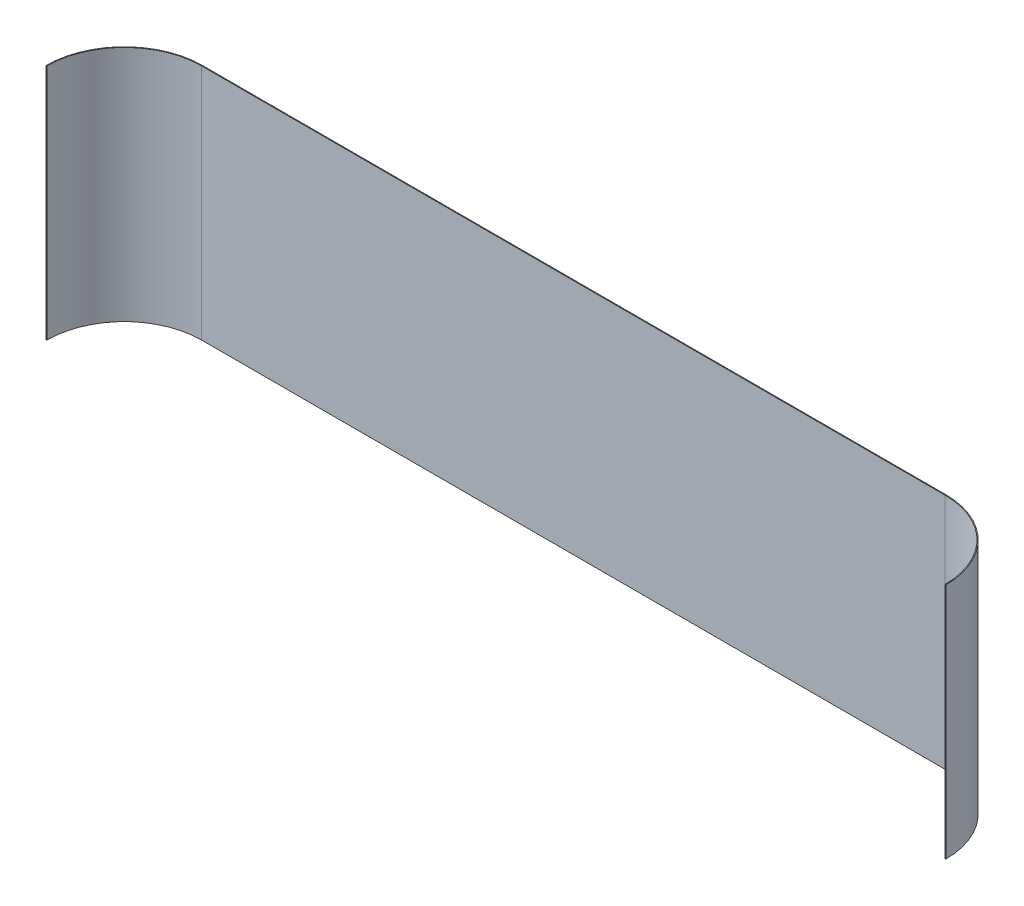
ISO-10303-21;
HEADER;
FILE_DESCRIPTION(('STEP AP214'),'2;1');
FILE_NAME('part.step','',(''),(''),'','','');
FILE_SCHEMA(('AUTOMOTIVE_DESIGN { 1 0 10303 214 1 1 1 1 }'));
ENDSEC;
DATA;
#1=APPLICATION_CONTEXT('core data for automotive mechanical design processes');
#2=APPLICATION_PROTOCOL_DEFINITION('international standard','automotive_design',2000,#1);
#3=PRODUCT_CONTEXT('',#1,'mechanical');
#4=PRODUCT('Part','Part','',(#3));
#5=PRODUCT_RELATED_PRODUCT_CATEGORY('part','',(#4));
#6=PRODUCT_DEFINITION_FORMATION('','',#4);
#7=PRODUCT_DEFINITION_CONTEXT('part definition',#1,'design');
#8=PRODUCT_DEFINITION('design','',#6,#7);
#9=PRODUCT_DEFINITION_SHAPE('','',#8);
#10=(LENGTH_UNIT() NAMED_UNIT(*) SI_UNIT(.MILLI.,.METRE.));
#11=(NAMED_UNIT(*) PLANE_ANGLE_UNIT() SI_UNIT($,.RADIAN.));
#12=(NAMED_UNIT(*) SI_UNIT($,.STERADIAN.) SOLID_ANGLE_UNIT());
#13=UNCERTAINTY_MEASURE_WITH_UNIT(LENGTH_MEASURE(1.E-05),#10,'distance_accuracy_value','');
#14=(GEOMETRIC_REPRESENTATION_CONTEXT(3) GLOBAL_UNCERTAINTY_ASSIGNED_CONTEXT((#13)) GLOBAL_UNIT_ASSIGNED_CONTEXT((#10,
#11,#12)) REPRESENTATION_CONTEXT('',''));
#15=CARTESIAN_POINT('',(0.,0.,0.));
#16=DIRECTION('',(0.,0.,1.));
#17=DIRECTION('',(1.,0.,0.));
#18=AXIS2_PLACEMENT_3D('',#15,#16,#17);
#19=CARTESIAN_POINT('',(-419.249999999999,230.,-39.8));
#20=DIRECTION('',(0.,1.,0.));
#21=DIRECTION('',(0.,0.,1.));
#22=AXIS2_PLACEMENT_3D('',#19,#20,#21);
#23=PLANE('',#22);
#24=DIRECTION('',(0.,0.,1.));
#25=VECTOR('',#24,1.);
#26=CARTESIAN_POINT('',(-419.249999999999,230.,-39.8));
#27=LINE('',#26,#25);
#28=CARTESIAN_POINT('',(-419.249999999999,230.,-39.8));
#29=VERTEX_POINT('',#28);
#30=CARTESIAN_POINT('',(-419.249999999999,230.,-39.));
#31=VERTEX_POINT('',#30);
#32=EDGE_CURVE('E11',#29,#31,#27,.T.);
#33=ORIENTED_EDGE('',*,*,#32,.F.);
#34=CARTESIAN_POINT('',(-419.25,230.,36.));
#35=DIRECTION('',(0.,1.,0.));
#36=DIRECTION('',(1.,0.,0.));
#37=AXIS2_PLACEMENT_3D('',#34,#35,#36);
#38=CIRCLE('',#37,75.8);
#39=CARTESIAN_POINT('',(-495.05,230.,36.0000000000005));
#40=VERTEX_POINT('',#39);
#41=EDGE_CURVE('E92',#29,#40,#38,.T.);
#42=ORIENTED_EDGE('',*,*,#41,.T.);
#43=DIRECTION('',(-1.,0.,0.));
#44=VECTOR('',#43,1.);
#45=CARTESIAN_POINT('',(-494.25,230.,36.0000000000005));
#46=LINE('',#45,#44);
#47=CARTESIAN_POINT('',(-494.25,230.,36.0000000000005));
#48=VERTEX_POINT('',#47);
#49=EDGE_CURVE('E341',#48,#40,#46,.T.);
#50=ORIENTED_EDGE('',*,*,#49,.F.);
#51=CARTESIAN_POINT('',(-419.25,230.,36.));
#52=DIRECTION('',(0.,1.,0.));
#53=DIRECTION('',(0.,0.,-1.));
#54=AXIS2_PLACEMENT_3D('',#51,#52,#53);
#55=CIRCLE('',#54,75.);
#56=EDGE_CURVE('E343',#31,#48,#55,.T.);
#57=ORIENTED_EDGE('',*,*,#56,.F.);
#58=EDGE_LOOP('',(#33,#42,#50,#57));
#59=FACE_BOUND('',#58,.T.);
#60=ADVANCED_FACE('F37',(#59),#23,.T.);
#61=CARTESIAN_POINT('',(-419.249999999999,0.,-39.));
#62=DIRECTION('',(0.,-1.,0.));
#63=DIRECTION('',(0.,0.,-1.));
#64=AXIS2_PLACEMENT_3D('',#61,#62,#63);
#65=PLANE('',#64);
#66=DIRECTION('',(0.,0.,-1.));
#67=VECTOR('',#66,1.);
#68=CARTESIAN_POINT('',(-419.249999999999,0.,-39.));
#69=LINE('',#68,#67);
#70=CARTESIAN_POINT('',(-419.249999999999,0.,-39.));
#71=VERTEX_POINT('',#70);
#72=CARTESIAN_POINT('',(-419.249999999999,0.,-39.8));
#73=VERTEX_POINT('',#72);
#74=EDGE_CURVE('E45',#71,#73,#69,.T.);
#75=ORIENTED_EDGE('',*,*,#74,.F.);
#76=CARTESIAN_POINT('',(-419.25,0.,36.));
#77=DIRECTION('',(0.,1.,0.));
#78=DIRECTION('',(0.,0.,-1.));
#79=AXIS2_PLACEMENT_3D('',#76,#77,#78);
#80=CIRCLE('',#79,75.);
#81=CARTESIAN_POINT('',(-494.25,0.,36.0000000000005));
#82=VERTEX_POINT('',#81);
#83=EDGE_CURVE('E145',#71,#82,#80,.T.);
#84=ORIENTED_EDGE('',*,*,#83,.T.);
#85=DIRECTION('',(-1.,0.,0.));
#86=VECTOR('',#85,1.);
#87=CARTESIAN_POINT('',(-494.25,0.,36.0000000000005));
#88=LINE('',#87,#86);
#89=CARTESIAN_POINT('',(-495.05,0.,36.0000000000005));
#90=VERTEX_POINT('',#89);
#91=EDGE_CURVE('E142',#82,#90,#88,.T.);
#92=ORIENTED_EDGE('',*,*,#91,.T.);
#93=CARTESIAN_POINT('',(-419.25,0.,36.));
#94=DIRECTION('',(0.,1.,0.));
#95=DIRECTION('',(1.,0.,0.));
#96=AXIS2_PLACEMENT_3D('',#93,#94,#95);
#97=CIRCLE('',#96,75.8);
#98=EDGE_CURVE('E139',#73,#90,#97,.T.);
#99=ORIENTED_EDGE('',*,*,#98,.F.);
#100=EDGE_LOOP('',(#75,#84,#92,#99));
#101=FACE_BOUND('',#100,.T.);
#102=ADVANCED_FACE('F197',(#101),#65,.T.);
#103=CARTESIAN_POINT('',(300.75,230.,-39.));
#104=DIRECTION('',(0.,1.,0.));
#105=DIRECTION('',(0.,0.,1.));
#106=AXIS2_PLACEMENT_3D('',#103,#104,#105);
#107=PLANE('',#106);
#108=DIRECTION('',(0.,0.,-1.));
#109=VECTOR('',#108,1.);
#110=CARTESIAN_POINT('',(300.75,230.,-39.));
#111=LINE('',#110,#109);
#112=CARTESIAN_POINT('',(300.75,230.,-39.));
#113=VERTEX_POINT('',#112);
#114=CARTESIAN_POINT('',(300.75,230.,-39.8));
#115=VERTEX_POINT('',#114);
#116=EDGE_CURVE('E172',#113,#115,#111,.T.);
#117=ORIENTED_EDGE('',*,*,#116,.F.);
#118=CARTESIAN_POINT('',(300.75,230.,36.));
#119=DIRECTION('',(0.,1.,0.));
#120=DIRECTION('',(0.,0.,-1.));
#121=AXIS2_PLACEMENT_3D('',#118,#119,#120);
#122=CIRCLE('',#121,75.);
#123=CARTESIAN_POINT('',(375.75,230.,36.));
#124=VERTEX_POINT('',#123);
#125=EDGE_CURVE('E131',#124,#113,#122,.T.);
#126=ORIENTED_EDGE('',*,*,#125,.F.);
#127=DIRECTION('',(-1.,0.,0.));
#128=VECTOR('',#127,1.);
#129=CARTESIAN_POINT('',(376.55,230.,36.));
#130=LINE('',#129,#128);
#131=CARTESIAN_POINT('',(376.55,230.,36.));
#132=VERTEX_POINT('',#131);
#133=EDGE_CURVE('E112',#132,#124,#130,.T.);
#134=ORIENTED_EDGE('',*,*,#133,.F.);
#135=CARTESIAN_POINT('',(300.75,230.,36.));
#136=DIRECTION('',(0.,1.,0.));
#137=DIRECTION('',(1.,0.,0.));
#138=AXIS2_PLACEMENT_3D('',#135,#136,#137);
#139=CIRCLE('',#138,75.8);
#140=EDGE_CURVE('E121',#132,#115,#139,.T.);
#141=ORIENTED_EDGE('',*,*,#140,.T.);
#142=EDGE_LOOP('',(#117,#126,#134,#141));
#143=FACE_BOUND('',#142,.T.);
#144=ADVANCED_FACE('F129',(#143),#107,.T.);
#145=CARTESIAN_POINT('',(300.75,0.,-39.8));
#146=DIRECTION('',(0.,-1.,0.));
#147=DIRECTION('',(0.,0.,-1.));
#148=AXIS2_PLACEMENT_3D('',#145,#146,#147);
#149=PLANE('',#148);
#150=DIRECTION('',(0.,0.,1.));
#151=VECTOR('',#150,1.);
#152=CARTESIAN_POINT('',(300.75,0.,-39.8));
#153=LINE('',#152,#151);
#154=CARTESIAN_POINT('',(300.75,0.,-39.8));
#155=VERTEX_POINT('',#154);
#156=CARTESIAN_POINT('',(300.75,0.,-39.));
#157=VERTEX_POINT('',#156);
#158=EDGE_CURVE('E80',#155,#157,#153,.T.);
#159=ORIENTED_EDGE('',*,*,#158,.F.);
#160=CARTESIAN_POINT('',(300.75,0.,36.));
#161=DIRECTION('',(0.,1.,0.));
#162=DIRECTION('',(1.,0.,0.));
#163=AXIS2_PLACEMENT_3D('',#160,#161,#162);
#164=CIRCLE('',#163,75.8);
#165=CARTESIAN_POINT('',(376.55,0.,36.));
#166=VERTEX_POINT('',#165);
#167=EDGE_CURVE('E153',#166,#155,#164,.T.);
#168=ORIENTED_EDGE('',*,*,#167,.F.);
#169=DIRECTION('',(-1.,0.,0.));
#170=VECTOR('',#169,1.);
#171=CARTESIAN_POINT('',(376.55,0.,36.));
#172=LINE('',#171,#170);
#173=CARTESIAN_POINT('',(375.75,0.,36.));
#174=VERTEX_POINT('',#173);
#175=EDGE_CURVE('E114',#166,#174,#172,.T.);
#176=ORIENTED_EDGE('',*,*,#175,.T.);
#177=CARTESIAN_POINT('',(300.75,0.,36.));
#178=DIRECTION('',(0.,1.,0.));
#179=DIRECTION('',(0.,0.,-1.));
#180=AXIS2_PLACEMENT_3D('',#177,#178,#179);
#181=CIRCLE('',#180,75.);
#182=EDGE_CURVE('E150',#174,#157,#181,.T.);
#183=ORIENTED_EDGE('',*,*,#182,.T.);
#184=EDGE_LOOP('',(#159,#168,#176,#183));
#185=FACE_BOUND('',#184,.T.);
#186=ADVANCED_FACE('F185',(#185),#149,.T.);
#187=CARTESIAN_POINT('',(-419.25,230.,36.));
#188=DIRECTION('',(0.,-1.,0.));
#189=DIRECTION('',(0.,0.,-1.));
#190=AXIS2_PLACEMENT_3D('',#187,#188,#189);
#191=CYLINDRICAL_SURFACE('',#190,75.8);
#192=ORIENTED_EDGE('',*,*,#98,.T.);
#193=DIRECTION('',(0.,-1.,0.));
#194=VECTOR('',#193,1.);
#195=CARTESIAN_POINT('',(-495.05,230.,36.0000000000005));
#196=LINE('',#195,#194);
#197=EDGE_CURVE('E169',#40,#90,#196,.T.);
#198=ORIENTED_EDGE('',*,*,#197,.F.);
#199=ORIENTED_EDGE('',*,*,#41,.F.);
#200=DIRECTION('',(0.,-1.,0.));
#201=VECTOR('',#200,1.);
#202=CARTESIAN_POINT('',(-419.249999999999,230.,-39.8));
#203=LINE('',#202,#201);
#204=EDGE_CURVE('E138',#29,#73,#203,.T.);
#205=ORIENTED_EDGE('',*,*,#204,.T.);
#206=EDGE_LOOP('',(#192,#198,#199,#205));
#207=FACE_BOUND('',#206,.T.);
#208=ADVANCED_FACE('F209',(#207),#191,.T.);
#209=CARTESIAN_POINT('',(-494.25,230.,36.0000000000005));
#210=DIRECTION('',(0.,0.,1.));
#211=DIRECTION('',(1.,0.,0.));
#212=AXIS2_PLACEMENT_3D('',#209,#210,#211);
#213=PLANE('',#212);
#214=ORIENTED_EDGE('',*,*,#91,.F.);
#215=DIRECTION('',(0.,-1.,0.));
#216=VECTOR('',#215,1.);
#217=CARTESIAN_POINT('',(-494.25,230.,36.0000000000005));
#218=LINE('',#217,#216);
#219=EDGE_CURVE('E167',#48,#82,#218,.T.);
#220=ORIENTED_EDGE('',*,*,#219,.F.);
#221=ORIENTED_EDGE('',*,*,#49,.T.);
#222=ORIENTED_EDGE('',*,*,#197,.T.);
#223=EDGE_LOOP('',(#214,#220,#221,#222));
#224=FACE_BOUND('',#223,.T.);
#225=ADVANCED_FACE('F212',(#224),#213,.T.);
#226=CARTESIAN_POINT('',(-419.25,230.,36.));
#227=DIRECTION('',(0.,-1.,0.));
#228=DIRECTION('',(0.,0.,-1.));
#229=AXIS2_PLACEMENT_3D('',#226,#227,#228);
#230=CYLINDRICAL_SURFACE('',#229,75.);
#231=ORIENTED_EDGE('',*,*,#83,.F.);
#232=DIRECTION('',(0.,-1.,0.));
#233=VECTOR('',#232,1.);
#234=CARTESIAN_POINT('',(-419.249999999999,230.,-39.));
#235=LINE('',#234,#233);
#236=EDGE_CURVE('E164',#31,#71,#235,.T.);
#237=ORIENTED_EDGE('',*,*,#236,.F.);
#238=ORIENTED_EDGE('',*,*,#56,.T.);
#239=ORIENTED_EDGE('',*,*,#219,.T.);
#240=EDGE_LOOP('',(#231,#237,#238,#239));
#241=FACE_BOUND('',#240,.T.);
#242=ADVANCED_FACE('F216',(#241),#230,.F.);
#243=CARTESIAN_POINT('',(-419.249999999999,230.,-39.));
#244=DIRECTION('',(0.,0.,1.));
#245=DIRECTION('',(1.,0.,0.));
#246=AXIS2_PLACEMENT_3D('',#243,#244,#245);
#247=PLANE('',#246);
#248=DIRECTION('',(-1.,0.,0.));
#249=VECTOR('',#248,1.);
#250=CARTESIAN_POINT('',(-419.249999999999,0.,-39.));
#251=LINE('',#250,#249);
#252=EDGE_CURVE('E148',#157,#71,#251,.T.);
#253=ORIENTED_EDGE('',*,*,#252,.F.);
#254=DIRECTION('',(0.,-1.,0.));
#255=VECTOR('',#254,1.);
#256=CARTESIAN_POINT('',(300.75,230.,-39.));
#257=LINE('',#256,#255);
#258=EDGE_CURVE('E161',#113,#157,#257,.T.);
#259=ORIENTED_EDGE('',*,*,#258,.F.);
#260=DIRECTION('',(-1.,0.,0.));
#261=VECTOR('',#260,1.);
#262=CARTESIAN_POINT('',(-419.249999999999,230.,-39.));
#263=LINE('',#262,#261);
#264=EDGE_CURVE('E133',#113,#31,#263,.T.);
#265=ORIENTED_EDGE('',*,*,#264,.T.);
#266=ORIENTED_EDGE('',*,*,#236,.T.);
#267=EDGE_LOOP('',(#253,#259,#265,#266));
#268=FACE_BOUND('',#267,.T.);
#269=ADVANCED_FACE('F181',(#268),#247,.T.);
#270=CARTESIAN_POINT('',(300.75,230.,36.));
#271=DIRECTION('',(0.,-1.,0.));
#272=DIRECTION('',(0.,0.,-1.));
#273=AXIS2_PLACEMENT_3D('',#270,#271,#272);
#274=CYLINDRICAL_SURFACE('',#273,75.);
#275=ORIENTED_EDGE('',*,*,#182,.F.);
#276=DIRECTION('',(0.,-1.,0.));
#277=VECTOR('',#276,1.);
#278=CARTESIAN_POINT('',(375.75,230.,36.));
#279=LINE('',#278,#277);
#280=EDGE_CURVE('E116',#124,#174,#279,.T.);
#281=ORIENTED_EDGE('',*,*,#280,.F.);
#282=ORIENTED_EDGE('',*,*,#125,.T.);
#283=ORIENTED_EDGE('',*,*,#258,.T.);
#284=EDGE_LOOP('',(#275,#281,#282,#283));
#285=FACE_BOUND('',#284,.T.);
#286=ADVANCED_FACE('F184',(#285),#274,.F.);
#287=CARTESIAN_POINT('',(376.55,230.,36.));
#288=DIRECTION('',(0.,0.,1.));
#289=DIRECTION('',(1.,0.,0.));
#290=AXIS2_PLACEMENT_3D('',#287,#288,#289);
#291=PLANE('',#290);
#292=ORIENTED_EDGE('',*,*,#175,.F.);
#293=DIRECTION('',(0.,-1.,0.));
#294=VECTOR('',#293,1.);
#295=CARTESIAN_POINT('',(376.55,230.,36.));
#296=LINE('',#295,#294);
#297=EDGE_CURVE('E108',#132,#166,#296,.T.);
#298=ORIENTED_EDGE('',*,*,#297,.F.);
#299=ORIENTED_EDGE('',*,*,#133,.T.);
#300=ORIENTED_EDGE('',*,*,#280,.T.);
#301=EDGE_LOOP('',(#292,#298,#299,#300));
#302=FACE_BOUND('',#301,.T.);
#303=ADVANCED_FACE('F110',(#302),#291,.T.);
#304=CARTESIAN_POINT('',(300.75,230.,36.));
#305=DIRECTION('',(0.,-1.,0.));
#306=DIRECTION('',(0.,0.,-1.));
#307=AXIS2_PLACEMENT_3D('',#304,#305,#306);
#308=CYLINDRICAL_SURFACE('',#307,75.8);
#309=ORIENTED_EDGE('',*,*,#167,.T.);
#310=DIRECTION('',(0.,-1.,0.));
#311=VECTOR('',#310,1.);
#312=CARTESIAN_POINT('',(300.75,230.,-39.8));
#313=LINE('',#312,#311);
#314=EDGE_CURVE('E117',#115,#155,#313,.T.);
#315=ORIENTED_EDGE('',*,*,#314,.F.);
#316=ORIENTED_EDGE('',*,*,#140,.F.);
#317=ORIENTED_EDGE('',*,*,#297,.T.);
#318=EDGE_LOOP('',(#309,#315,#316,#317));
#319=FACE_BOUND('',#318,.T.);
#320=ADVANCED_FACE('F122',(#319),#308,.T.);
#321=CARTESIAN_POINT('',(-419.249999999999,230.,-39.8));
#322=DIRECTION('',(0.,0.,1.));
#323=DIRECTION('',(1.,0.,0.));
#324=AXIS2_PLACEMENT_3D('',#321,#322,#323);
#325=PLANE('',#324);
#326=DIRECTION('',(1.,0.,0.));
#327=VECTOR('',#326,1.);
#328=CARTESIAN_POINT('',(-419.249999999999,0.,-39.8));
#329=LINE('',#328,#327);
#330=EDGE_CURVE('E155',#155,#73,#329,.F.);
#331=ORIENTED_EDGE('',*,*,#330,.T.);
#332=ORIENTED_EDGE('',*,*,#204,.F.);
#333=DIRECTION('',(1.,0.,0.));
#334=VECTOR('',#333,1.);
#335=CARTESIAN_POINT('',(-419.249999999999,230.,-39.8));
#336=LINE('',#335,#334);
#337=EDGE_CURVE('E126',#115,#29,#336,.F.);
#338=ORIENTED_EDGE('',*,*,#337,.F.);
#339=ORIENTED_EDGE('',*,*,#314,.T.);
#340=EDGE_LOOP('',(#331,#332,#338,#339));
#341=FACE_BOUND('',#340,.T.);
#342=ADVANCED_FACE('F187',(#341),#325,.F.);
#343=CARTESIAN_POINT('',(-419.25,230.,36.));
#344=DIRECTION('',(0.,1.,0.));
#345=DIRECTION('',(1.,0.,0.));
#346=AXIS2_PLACEMENT_3D('',#343,#344,#345);
#347=PLANE('',#346);
#348=ORIENTED_EDGE('',*,*,#337,.T.);
#349=ORIENTED_EDGE('',*,*,#32,.T.);
#350=ORIENTED_EDGE('',*,*,#264,.F.);
#351=ORIENTED_EDGE('',*,*,#116,.T.);
#352=EDGE_LOOP('',(#348,#349,#350,#351));
#353=FACE_BOUND('',#352,.T.);
#354=ADVANCED_FACE('F175',(#353),#347,.T.);
#355=CARTESIAN_POINT('',(-419.25,0.,36.));
#356=DIRECTION('',(0.,1.,0.));
#357=DIRECTION('',(1.,0.,0.));
#358=AXIS2_PLACEMENT_3D('',#355,#356,#357);
#359=PLANE('',#358);
#360=ORIENTED_EDGE('',*,*,#252,.T.);
#361=ORIENTED_EDGE('',*,*,#74,.T.);
#362=ORIENTED_EDGE('',*,*,#330,.F.);
#363=ORIENTED_EDGE('',*,*,#158,.T.);
#364=EDGE_LOOP('',(#360,#361,#362,#363));
#365=FACE_BOUND('',#364,.T.);
#366=ADVANCED_FACE('F188',(#365),#359,.F.);
#367=CLOSED_SHELL('',(#60,#102,#144,#186,#208,#225,#242,#269,#286,#303,#320,#342,#354,#366));
#368=MANIFOLD_SOLID_BREP('B2',#367);
#369=ADVANCED_BREP_SHAPE_REPRESENTATION('',(#18,#368),#14);
#370=SHAPE_DEFINITION_REPRESENTATION(#9,#369);
ENDSEC;
END-ISO-10303-21;
